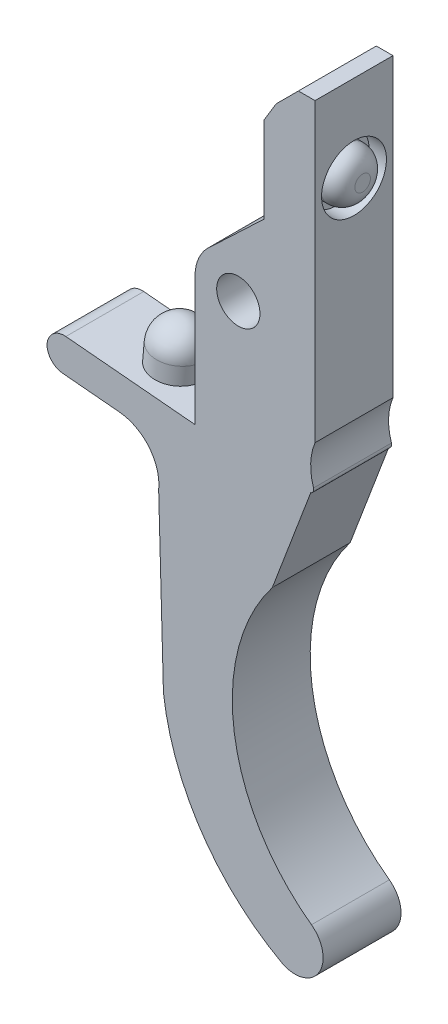
ISO-10303-21;
HEADER;
FILE_DESCRIPTION(('STEP AP214'),'2;1');
FILE_NAME('part.step','',(''),(''),'','','');
FILE_SCHEMA(('AUTOMOTIVE_DESIGN { 1 0 10303 214 1 1 1 1 }'));
ENDSEC;
DATA;
#1=APPLICATION_CONTEXT('core data for automotive mechanical design processes');
#2=APPLICATION_PROTOCOL_DEFINITION('international standard','automotive_design',2000,#1);
#3=PRODUCT_CONTEXT('',#1,'mechanical');
#4=PRODUCT('Part','Part','',(#3));
#5=PRODUCT_RELATED_PRODUCT_CATEGORY('part','',(#4));
#6=PRODUCT_DEFINITION_FORMATION('','',#4);
#7=PRODUCT_DEFINITION_CONTEXT('part definition',#1,'design');
#8=PRODUCT_DEFINITION('design','',#6,#7);
#9=PRODUCT_DEFINITION_SHAPE('','',#8);
#10=(LENGTH_UNIT() NAMED_UNIT(*) SI_UNIT(.MILLI.,.METRE.));
#11=(NAMED_UNIT(*) PLANE_ANGLE_UNIT() SI_UNIT($,.RADIAN.));
#12=(NAMED_UNIT(*) SI_UNIT($,.STERADIAN.) SOLID_ANGLE_UNIT());
#13=UNCERTAINTY_MEASURE_WITH_UNIT(LENGTH_MEASURE(1.E-05),#10,'distance_accuracy_value','');
#14=(GEOMETRIC_REPRESENTATION_CONTEXT(3) GLOBAL_UNCERTAINTY_ASSIGNED_CONTEXT((#13)) GLOBAL_UNIT_ASSIGNED_CONTEXT((#10,
#11,#12)) REPRESENTATION_CONTEXT('',''));
#15=CARTESIAN_POINT('',(0.,0.,0.));
#16=DIRECTION('',(0.,0.,1.));
#17=DIRECTION('',(1.,0.,0.));
#18=AXIS2_PLACEMENT_3D('',#15,#16,#17);
#19=CARTESIAN_POINT('',(8.86641034320198,0.,9.));
#20=DIRECTION('',(1.,0.,0.));
#21=DIRECTION('',(0.,1.,0.));
#22=AXIS2_PLACEMENT_3D('',#19,#20,#21);
#23=PLANE('',#22);
#24=CARTESIAN_POINT('',(8.86641034320198,14.5013390739284,4.5));
#25=DIRECTION('',(1.,0.,0.));
#26=DIRECTION('',(0.,1.,0.));
#27=AXIS2_PLACEMENT_3D('',#24,#25,#26);
#28=CIRCLE('',#27,3.75);
#29=CARTESIAN_POINT('',(8.86641034320198,18.2513390739284,4.5));
#30=VERTEX_POINT('',#29);
#31=EDGE_CURVE('E408',#30,#30,#28,.T.);
#32=ORIENTED_EDGE('',*,*,#31,.F.);
#33=EDGE_LOOP('',(#32));
#34=FACE_BOUND('',#33,.T.);
#35=DIRECTION('',(0.,-1.,0.));
#36=VECTOR('',#35,1.);
#37=CARTESIAN_POINT('',(8.86641034320198,0.,0.));
#38=LINE('',#37,#36);
#39=CARTESIAN_POINT('',(8.86641034320198,24.5013390739284,0.));
#40=VERTEX_POINT('',#39);
#41=CARTESIAN_POINT('',(8.86641034320198,-9.7282368546235,0.));
#42=VERTEX_POINT('',#41);
#43=EDGE_CURVE('E206',#40,#42,#38,.T.);
#44=ORIENTED_EDGE('',*,*,#43,.F.);
#45=DIRECTION('',(0.,0.,-1.));
#46=VECTOR('',#45,1.);
#47=CARTESIAN_POINT('',(8.86641034320198,24.5013390739284,9.));
#48=LINE('',#47,#46);
#49=CARTESIAN_POINT('',(8.86641034320198,24.5013390739284,9.));
#50=VERTEX_POINT('',#49);
#51=EDGE_CURVE('E123',#50,#40,#48,.T.);
#52=ORIENTED_EDGE('',*,*,#51,.F.);
#53=DIRECTION('',(0.,-1.,0.));
#54=VECTOR('',#53,1.);
#55=CARTESIAN_POINT('',(8.86641034320198,0.,9.));
#56=LINE('',#55,#54);
#57=CARTESIAN_POINT('',(8.86641034320198,-9.7282368546235,9.));
#58=VERTEX_POINT('',#57);
#59=EDGE_CURVE('E253',#50,#58,#56,.T.);
#60=ORIENTED_EDGE('',*,*,#59,.T.);
#61=DIRECTION('',(0.,0.,-1.));
#62=VECTOR('',#61,1.);
#63=CARTESIAN_POINT('',(8.86641034320198,-9.7282368546235,9.));
#64=LINE('',#63,#62);
#65=EDGE_CURVE('E52',#58,#42,#64,.T.);
#66=ORIENTED_EDGE('',*,*,#65,.T.);
#67=EDGE_LOOP('',(#44,#52,#60,#66));
#68=FACE_BOUND('',#67,.T.);
#69=ADVANCED_FACE('F35',(#34,#68),#23,.T.);
#70=CARTESIAN_POINT('',(0.,24.5013390739284,9.));
#71=DIRECTION('',(0.,1.,0.));
#72=DIRECTION('',(0.,0.,1.));
#73=AXIS2_PLACEMENT_3D('',#70,#71,#72);
#74=PLANE('',#73);
#75=DIRECTION('',(1.,0.,0.));
#76=VECTOR('',#75,1.);
#77=CARTESIAN_POINT('',(0.,24.5013390739284,0.));
#78=LINE('',#77,#76);
#79=CARTESIAN_POINT('',(6.94213708303368,24.5013390739284,0.));
#80=VERTEX_POINT('',#79);
#81=EDGE_CURVE('E208',#80,#40,#78,.T.);
#82=ORIENTED_EDGE('',*,*,#81,.F.);
#83=DIRECTION('',(0.,0.,-1.));
#84=VECTOR('',#83,1.);
#85=CARTESIAN_POINT('',(6.94213708303368,24.5013390739284,9.));
#86=LINE('',#85,#84);
#87=CARTESIAN_POINT('',(6.94213708303368,24.5013390739284,9.));
#88=VERTEX_POINT('',#87);
#89=EDGE_CURVE('E298',#88,#80,#86,.T.);
#90=ORIENTED_EDGE('',*,*,#89,.F.);
#91=DIRECTION('',(1.,0.,0.));
#92=VECTOR('',#91,1.);
#93=CARTESIAN_POINT('',(0.,24.5013390739284,9.));
#94=LINE('',#93,#92);
#95=EDGE_CURVE('E416',#88,#50,#94,.T.);
#96=ORIENTED_EDGE('',*,*,#95,.T.);
#97=ORIENTED_EDGE('',*,*,#51,.T.);
#98=EDGE_LOOP('',(#82,#90,#96,#97));
#99=FACE_BOUND('',#98,.T.);
#100=ADVANCED_FACE('F372',(#99),#74,.T.);
#101=CARTESIAN_POINT('',(-8.7796009954474,8.77960099544748,9.));
#102=DIRECTION('',(0.707106781186544,-0.707106781186551,0.));
#103=DIRECTION('',(0.707106781186551,0.707106781186544,0.));
#104=AXIS2_PLACEMENT_3D('',#101,#102,#103);
#105=PLANE('',#104);
#106=DIRECTION('',(-0.707106781186551,-0.707106781186544,0.));
#107=VECTOR('',#106,1.);
#108=CARTESIAN_POINT('',(-8.7796009954474,8.77960099544748,0.));
#109=LINE('',#108,#107);
#110=CARTESIAN_POINT('',(4.38418703911308,21.9433890300078,0.));
#111=VERTEX_POINT('',#110);
#112=EDGE_CURVE('E212',#80,#111,#109,.T.);
#113=ORIENTED_EDGE('',*,*,#112,.T.);
#114=DIRECTION('',(0.,0.,-1.));
#115=VECTOR('',#114,1.);
#116=CARTESIAN_POINT('',(4.38418703911308,21.9433890300078,9.));
#117=LINE('',#116,#115);
#118=CARTESIAN_POINT('',(4.38418703911308,21.9433890300078,9.));
#119=VERTEX_POINT('',#118);
#120=EDGE_CURVE('E295',#119,#111,#117,.T.);
#121=ORIENTED_EDGE('',*,*,#120,.F.);
#122=DIRECTION('',(-0.707106781186551,-0.707106781186544,0.));
#123=VECTOR('',#122,1.);
#124=CARTESIAN_POINT('',(-8.7796009954474,8.77960099544748,9.));
#125=LINE('',#124,#123);
#126=EDGE_CURVE('E419',#88,#119,#125,.T.);
#127=ORIENTED_EDGE('',*,*,#126,.F.);
#128=ORIENTED_EDGE('',*,*,#89,.T.);
#129=EDGE_LOOP('',(#113,#121,#127,#128));
#130=FACE_BOUND('',#129,.T.);
#131=ADVANCED_FACE('F378',(#130),#105,.F.);
#132=CARTESIAN_POINT('',(-6.54897874261379,3.98764051774951,9.));
#133=DIRECTION('',(0.854122918146898,-0.520071188104309,0.));
#134=DIRECTION('',(0.520071188104309,0.854122918146898,0.));
#135=AXIS2_PLACEMENT_3D('',#132,#133,#134);
#136=PLANE('',#135);
#137=DIRECTION('',(-0.520071188104309,-0.854122918146898,0.));
#138=VECTOR('',#137,1.);
#139=CARTESIAN_POINT('',(-6.54897874261379,3.98764051774951,0.));
#140=LINE('',#139,#138);
#141=CARTESIAN_POINT('',(2.98776814859473,19.6500234196719,0.));
#142=VERTEX_POINT('',#141);
#143=EDGE_CURVE('E214',#111,#142,#140,.T.);
#144=ORIENTED_EDGE('',*,*,#143,.T.);
#145=DIRECTION('',(0.,0.,-1.));
#146=VECTOR('',#145,1.);
#147=CARTESIAN_POINT('',(2.98776814859473,19.6500234196719,9.));
#148=LINE('',#147,#146);
#149=CARTESIAN_POINT('',(2.98776814859473,19.6500234196719,9.));
#150=VERTEX_POINT('',#149);
#151=EDGE_CURVE('E292',#150,#142,#148,.T.);
#152=ORIENTED_EDGE('',*,*,#151,.F.);
#153=DIRECTION('',(-0.520071188104309,-0.854122918146898,0.));
#154=VECTOR('',#153,1.);
#155=CARTESIAN_POINT('',(-6.54897874261379,3.98764051774951,9.));
#156=LINE('',#155,#154);
#157=EDGE_CURVE('E421',#119,#150,#156,.T.);
#158=ORIENTED_EDGE('',*,*,#157,.F.);
#159=ORIENTED_EDGE('',*,*,#120,.T.);
#160=EDGE_LOOP('',(#144,#152,#158,#159));
#161=FACE_BOUND('',#160,.T.);
#162=ADVANCED_FACE('F454',(#161),#136,.F.);
#163=CARTESIAN_POINT('',(2.98776814859473,0.,9.));
#164=DIRECTION('',(1.,0.,0.));
#165=DIRECTION('',(0.,0.,-1.));
#166=AXIS2_PLACEMENT_3D('',#163,#164,#165);
#167=PLANE('',#166);
#168=DIRECTION('',(0.,-1.,0.));
#169=VECTOR('',#168,1.);
#170=CARTESIAN_POINT('',(2.98776814859473,0.,0.));
#171=LINE('',#170,#169);
#172=CARTESIAN_POINT('',(2.98776814859473,9.70876495048378,0.));
#173=VERTEX_POINT('',#172);
#174=EDGE_CURVE('E216',#142,#173,#171,.T.);
#175=ORIENTED_EDGE('',*,*,#174,.T.);
#176=DIRECTION('',(0.,0.,-1.));
#177=VECTOR('',#176,1.);
#178=CARTESIAN_POINT('',(2.98776814859473,9.70876495048378,9.));
#179=LINE('',#178,#177);
#180=CARTESIAN_POINT('',(2.98776814859473,9.70876495048378,9.));
#181=VERTEX_POINT('',#180);
#182=EDGE_CURVE('E289',#181,#173,#179,.T.);
#183=ORIENTED_EDGE('',*,*,#182,.F.);
#184=DIRECTION('',(0.,-1.,0.));
#185=VECTOR('',#184,1.);
#186=CARTESIAN_POINT('',(2.98776814859473,0.,9.));
#187=LINE('',#186,#185);
#188=EDGE_CURVE('E423',#150,#181,#187,.T.);
#189=ORIENTED_EDGE('',*,*,#188,.F.);
#190=ORIENTED_EDGE('',*,*,#151,.T.);
#191=EDGE_LOOP('',(#175,#183,#189,#190));
#192=FACE_BOUND('',#191,.T.);
#193=ADVANCED_FACE('F448',(#192),#167,.F.);
#194=CARTESIAN_POINT('',(-3.43271517060493,3.61933643419605,9.));
#195=DIRECTION('',(0.688153412758932,-0.725565214510891,0.));
#196=DIRECTION('',(0.725565214510891,0.688153412758932,0.));
#197=AXIS2_PLACEMENT_3D('',#194,#195,#196);
#198=PLANE('',#197);
#199=DIRECTION('',(-0.725565214510891,-0.688153412758932,0.));
#200=VECTOR('',#199,1.);
#201=CARTESIAN_POINT('',(-3.43271517060493,3.61933643419605,0.));
#202=LINE('',#201,#200);
#203=CARTESIAN_POINT('',(-3.18467124544874,3.85459064732067,0.));
#204=VERTEX_POINT('',#203);
#205=EDGE_CURVE('E218',#173,#204,#202,.T.);
#206=ORIENTED_EDGE('',*,*,#205,.T.);
#207=DIRECTION('',(0.,0.,-1.));
#208=VECTOR('',#207,1.);
#209=CARTESIAN_POINT('',(-3.18467124544874,3.85459064732067,9.));
#210=LINE('',#209,#208);
#211=CARTESIAN_POINT('',(-3.18467124544874,3.85459064732067,9.));
#212=VERTEX_POINT('',#211);
#213=EDGE_CURVE('E286',#212,#204,#210,.T.);
#214=ORIENTED_EDGE('',*,*,#213,.F.);
#215=DIRECTION('',(-0.725565214510891,-0.688153412758932,0.));
#216=VECTOR('',#215,1.);
#217=CARTESIAN_POINT('',(-3.43271517060493,3.61933643419605,9.));
#218=LINE('',#217,#216);
#219=EDGE_CURVE('E425',#181,#212,#218,.T.);
#220=ORIENTED_EDGE('',*,*,#219,.F.);
#221=ORIENTED_EDGE('',*,*,#182,.T.);
#222=EDGE_LOOP('',(#206,#214,#220,#221));
#223=FACE_BOUND('',#222,.T.);
#224=ADVANCED_FACE('F444',(#223),#198,.F.);
#225=CARTESIAN_POINT('',(0.,0.,9.));
#226=DIRECTION('',(0.,0.,-1.));
#227=DIRECTION('',(-1.,0.,0.));
#228=AXIS2_PLACEMENT_3D('',#225,#226,#227);
#229=CYLINDRICAL_SURFACE('',#228,5.);
#230=CARTESIAN_POINT('',(0.,0.,0.));
#231=DIRECTION('',(0.,0.,1.));
#232=DIRECTION('',(1.,0.,0.));
#233=AXIS2_PLACEMENT_3D('',#230,#231,#232);
#234=CIRCLE('',#233,5.);
#235=CARTESIAN_POINT('',(-5.,0.,0.));
#236=VERTEX_POINT('',#235);
#237=EDGE_CURVE('E220',#204,#236,#234,.T.);
#238=ORIENTED_EDGE('',*,*,#237,.T.);
#239=DIRECTION('',(0.,0.,-1.));
#240=VECTOR('',#239,1.);
#241=CARTESIAN_POINT('',(-5.,0.,9.));
#242=LINE('',#241,#240);
#243=CARTESIAN_POINT('',(-5.,0.,9.));
#244=VERTEX_POINT('',#243);
#245=EDGE_CURVE('E283',#244,#236,#242,.T.);
#246=ORIENTED_EDGE('',*,*,#245,.F.);
#247=CARTESIAN_POINT('',(0.,0.,9.));
#248=DIRECTION('',(0.,0.,1.));
#249=DIRECTION('',(1.,0.,0.));
#250=AXIS2_PLACEMENT_3D('',#247,#248,#249);
#251=CIRCLE('',#250,5.);
#252=EDGE_CURVE('E427',#212,#244,#251,.T.);
#253=ORIENTED_EDGE('',*,*,#252,.F.);
#254=ORIENTED_EDGE('',*,*,#213,.T.);
#255=EDGE_LOOP('',(#238,#246,#253,#254));
#256=FACE_BOUND('',#255,.T.);
#257=ADVANCED_FACE('F440',(#256),#229,.T.);
#258=CARTESIAN_POINT('',(-5.,0.,9.));
#259=DIRECTION('',(1.,0.,0.));
#260=DIRECTION('',(0.,0.,-1.));
#261=AXIS2_PLACEMENT_3D('',#258,#259,#260);
#262=PLANE('',#261);
#263=DIRECTION('',(0.,-1.,0.));
#264=VECTOR('',#263,1.);
#265=CARTESIAN_POINT('',(-5.,0.,0.));
#266=LINE('',#265,#264);
#267=CARTESIAN_POINT('',(-5.,-14.8544261697836,0.));
#268=VERTEX_POINT('',#267);
#269=EDGE_CURVE('E222',#236,#268,#266,.T.);
#270=ORIENTED_EDGE('',*,*,#269,.T.);
#271=DIRECTION('',(0.,0.,-1.));
#272=VECTOR('',#271,1.);
#273=CARTESIAN_POINT('',(-5.,-14.8544261697836,9.));
#274=LINE('',#273,#272);
#275=CARTESIAN_POINT('',(-5.,-14.8544261697836,9.));
#276=VERTEX_POINT('',#275);
#277=EDGE_CURVE('E280',#276,#268,#274,.T.);
#278=ORIENTED_EDGE('',*,*,#277,.F.);
#279=DIRECTION('',(0.,-1.,0.));
#280=VECTOR('',#279,1.);
#281=CARTESIAN_POINT('',(-5.,0.,9.));
#282=LINE('',#281,#280);
#283=EDGE_CURVE('E429',#244,#276,#282,.T.);
#284=ORIENTED_EDGE('',*,*,#283,.F.);
#285=ORIENTED_EDGE('',*,*,#245,.T.);
#286=EDGE_LOOP('',(#270,#278,#284,#285));
#287=FACE_BOUND('',#286,.T.);
#288=ADVANCED_FACE('F315',(#287),#262,.F.);
#289=CARTESIAN_POINT('',(-1.38130681904962,-15.1836310581113,9.));
#290=DIRECTION('',(-0.0905992835595562,-0.995887428286197,0.));
#291=DIRECTION('',(0.995887428286197,-0.0905992835595562,0.));
#292=AXIS2_PLACEMENT_3D('',#289,#290,#291);
#293=PLANE('',#292);
#294=CARTESIAN_POINT('',(-11.4732682838603,-14.2655308266464,4.5));
#295=DIRECTION('',(-0.0905992835595562,-0.995887428286197,0.));
#296=DIRECTION('',(0.995887428286197,-0.0905992835595562,0.));
#297=AXIS2_PLACEMENT_3D('',#294,#295,#296);
#298=CIRCLE('',#297,2.9);
#299=CARTESIAN_POINT('',(-8.58519474183031,-14.5282687489692,4.5));
#300=VERTEX_POINT('',#299);
#301=EDGE_CURVE('E44',#300,#300,#298,.F.);
#302=ORIENTED_EDGE('',*,*,#301,.F.);
#303=EDGE_LOOP('',(#302));
#304=FACE_BOUND('',#303,.T.);
#305=DIRECTION('',(-0.995887428286197,0.0905992835595562,0.));
#306=VECTOR('',#305,1.);
#307=CARTESIAN_POINT('',(-1.38130681904962,-15.1836310581113,0.));
#308=LINE('',#307,#306);
#309=CARTESIAN_POINT('',(-19.9214872547559,-13.4969674686025,0.));
#310=VERTEX_POINT('',#309);
#311=EDGE_CURVE('E224',#268,#310,#308,.T.);
#312=ORIENTED_EDGE('',*,*,#311,.T.);
#313=DIRECTION('',(0.,0.,-1.));
#314=VECTOR('',#313,1.);
#315=CARTESIAN_POINT('',(-19.9214872547559,-13.4969674686025,9.));
#316=LINE('',#315,#314);
#317=CARTESIAN_POINT('',(-19.9214872547559,-13.4969674686025,9.));
#318=VERTEX_POINT('',#317);
#319=EDGE_CURVE('E277',#318,#310,#316,.T.);
#320=ORIENTED_EDGE('',*,*,#319,.F.);
#321=DIRECTION('',(-0.995887428286197,0.0905992835595562,0.));
#322=VECTOR('',#321,1.);
#323=CARTESIAN_POINT('',(-1.38130681904962,-15.1836310581113,9.));
#324=LINE('',#323,#322);
#325=EDGE_CURVE('E431',#276,#318,#324,.T.);
#326=ORIENTED_EDGE('',*,*,#325,.F.);
#327=ORIENTED_EDGE('',*,*,#277,.T.);
#328=EDGE_LOOP('',(#312,#320,#326,#327));
#329=FACE_BOUND('',#328,.T.);
#330=ADVANCED_FACE('F311',(#304,#329),#293,.F.);
#331=CARTESIAN_POINT('',(-20.102685821875,-15.4887423251749,9.));
#332=DIRECTION('',(0.,0.,-1.));
#333=DIRECTION('',(-1.,0.,0.));
#334=AXIS2_PLACEMENT_3D('',#331,#332,#333);
#335=CYLINDRICAL_SURFACE('',#334,2.);
#336=CARTESIAN_POINT('',(-20.102685821875,-15.4887423251749,0.));
#337=DIRECTION('',(0.,0.,1.));
#338=DIRECTION('',(1.,0.,0.));
#339=AXIS2_PLACEMENT_3D('',#336,#337,#338);
#340=CIRCLE('',#339,2.);
#341=CARTESIAN_POINT('',(-22.1026733060009,-15.4958178703594,0.));
#342=VERTEX_POINT('',#341);
#343=EDGE_CURVE('E226',#310,#342,#340,.T.);
#344=ORIENTED_EDGE('',*,*,#343,.T.);
#345=DIRECTION('',(0.,0.,-1.));
#346=VECTOR('',#345,1.);
#347=CARTESIAN_POINT('',(-22.1026733060009,-15.4958178703594,9.));
#348=LINE('',#347,#346);
#349=CARTESIAN_POINT('',(-22.1026733060009,-15.4958178703594,9.));
#350=VERTEX_POINT('',#349);
#351=EDGE_CURVE('E274',#350,#342,#348,.T.);
#352=ORIENTED_EDGE('',*,*,#351,.F.);
#353=CARTESIAN_POINT('',(-20.102685821875,-15.4887423251749,9.));
#354=DIRECTION('',(0.,0.,1.));
#355=DIRECTION('',(1.,0.,0.));
#356=AXIS2_PLACEMENT_3D('',#353,#354,#355);
#357=CIRCLE('',#356,2.);
#358=EDGE_CURVE('E327',#318,#350,#357,.T.);
#359=ORIENTED_EDGE('',*,*,#358,.F.);
#360=ORIENTED_EDGE('',*,*,#319,.T.);
#361=EDGE_LOOP('',(#344,#352,#359,#360));
#362=FACE_BOUND('',#361,.T.);
#363=ADVANCED_FACE('F314',(#362),#335,.T.);
#364=CARTESIAN_POINT('',(-20.1065365163499,-15.371568455867,9.));
#365=DIRECTION('',(0.,0.,-1.));
#366=DIRECTION('',(-1.,0.,0.));
#367=AXIS2_PLACEMENT_3D('',#364,#365,#366);
#368=CYLINDRICAL_SURFACE('',#367,2.);
#369=CARTESIAN_POINT('',(-20.1065365163499,-15.371568455867,0.));
#370=DIRECTION('',(0.,0.,1.));
#371=DIRECTION('',(1.,0.,0.));
#372=AXIS2_PLACEMENT_3D('',#369,#370,#371);
#373=CIRCLE('',#372,2.);
#374=CARTESIAN_POINT('',(-20.287735083469,-17.3633433124394,0.));
#375=VERTEX_POINT('',#374);
#376=EDGE_CURVE('E228',#342,#375,#373,.T.);
#377=ORIENTED_EDGE('',*,*,#376,.T.);
#378=DIRECTION('',(0.,0.,-1.));
#379=VECTOR('',#378,1.);
#380=CARTESIAN_POINT('',(-20.287735083469,-17.3633433124394,9.));
#381=LINE('',#380,#379);
#382=CARTESIAN_POINT('',(-20.287735083469,-17.3633433124394,9.));
#383=VERTEX_POINT('',#382);
#384=EDGE_CURVE('E271',#383,#375,#381,.T.);
#385=ORIENTED_EDGE('',*,*,#384,.F.);
#386=CARTESIAN_POINT('',(-20.1065365163499,-15.371568455867,9.));
#387=DIRECTION('',(0.,0.,1.));
#388=DIRECTION('',(1.,0.,0.));
#389=AXIS2_PLACEMENT_3D('',#386,#387,#388);
#390=CIRCLE('',#389,2.);
#391=EDGE_CURVE('E344',#350,#383,#390,.T.);
#392=ORIENTED_EDGE('',*,*,#391,.F.);
#393=ORIENTED_EDGE('',*,*,#351,.T.);
#394=EDGE_LOOP('',(#377,#385,#392,#393));
#395=FACE_BOUND('',#394,.T.);
#396=ADVANCED_FACE('F335',(#395),#368,.T.);
#397=CARTESIAN_POINT('',(-1.73316335058424,-19.0513161274458,9.));
#398=DIRECTION('',(0.090599283559557,0.995887428286197,0.));
#399=DIRECTION('',(-0.995887428286197,0.090599283559557,0.));
#400=AXIS2_PLACEMENT_3D('',#397,#398,#399);
#401=PLANE('',#400);
#402=DIRECTION('',(0.995887428286197,-0.090599283559557,0.));
#403=VECTOR('',#402,1.);
#404=CARTESIAN_POINT('',(-1.73316335058424,-19.0513161274458,0.));
#405=LINE('',#404,#403);
#406=CARTESIAN_POINT('',(-13.71695870258,-17.9611093004718,0.));
#407=VERTEX_POINT('',#406);
#408=EDGE_CURVE('E230',#375,#407,#405,.T.);
#409=ORIENTED_EDGE('',*,*,#408,.T.);
#410=DIRECTION('',(0.,0.,-1.));
#411=VECTOR('',#410,1.);
#412=CARTESIAN_POINT('',(-13.71695870258,-17.9611093004718,9.));
#413=LINE('',#412,#411);
#414=CARTESIAN_POINT('',(-13.71695870258,-17.9611093004718,9.));
#415=VERTEX_POINT('',#414);
#416=EDGE_CURVE('E268',#415,#407,#413,.T.);
#417=ORIENTED_EDGE('',*,*,#416,.F.);
#418=DIRECTION('',(0.995887428286197,-0.090599283559557,0.));
#419=VECTOR('',#418,1.);
#420=CARTESIAN_POINT('',(-1.73316335058424,-19.0513161274458,9.));
#421=LINE('',#420,#419);
#422=EDGE_CURVE('E341',#383,#415,#421,.T.);
#423=ORIENTED_EDGE('',*,*,#422,.F.);
#424=ORIENTED_EDGE('',*,*,#384,.T.);
#425=EDGE_LOOP('',(#409,#417,#423,#424));
#426=FACE_BOUND('',#425,.T.);
#427=ADVANCED_FACE('F339',(#426),#401,.F.);
#428=CARTESIAN_POINT('',(-14.1699551203777,-22.9405464419028,9.));
#429=DIRECTION('',(0.,0.,-1.));
#430=DIRECTION('',(-1.,0.,0.));
#431=AXIS2_PLACEMENT_3D('',#428,#429,#430);
#432=CYLINDRICAL_SURFACE('',#431,5.);
#433=CARTESIAN_POINT('',(-14.1699551203777,-22.9405464419028,0.));
#434=DIRECTION('',(0.,0.,1.));
#435=DIRECTION('',(1.,0.,0.));
#436=AXIS2_PLACEMENT_3D('',#433,#434,#435);
#437=CIRCLE('',#436,5.);
#438=CARTESIAN_POINT('',(-9.20101774553042,-23.497018691746,0.));
#439=VERTEX_POINT('',#438);
#440=EDGE_CURVE('E232',#407,#439,#437,.F.);
#441=ORIENTED_EDGE('',*,*,#440,.T.);
#442=DIRECTION('',(0.,0.,-1.));
#443=VECTOR('',#442,1.);
#444=CARTESIAN_POINT('',(-9.20101774553042,-23.497018691746,9.));
#445=LINE('',#444,#443);
#446=CARTESIAN_POINT('',(-9.20101774553042,-23.497018691746,9.));
#447=VERTEX_POINT('',#446);
#448=EDGE_CURVE('E265',#447,#439,#445,.T.);
#449=ORIENTED_EDGE('',*,*,#448,.F.);
#450=CARTESIAN_POINT('',(-14.1699551203777,-22.9405464419028,9.));
#451=DIRECTION('',(0.,0.,1.));
#452=DIRECTION('',(1.,0.,0.));
#453=AXIS2_PLACEMENT_3D('',#450,#451,#452);
#454=CIRCLE('',#453,5.);
#455=EDGE_CURVE('E343',#415,#447,#454,.F.);
#456=ORIENTED_EDGE('',*,*,#455,.F.);
#457=ORIENTED_EDGE('',*,*,#416,.T.);
#458=EDGE_LOOP('',(#441,#449,#456,#457));
#459=FACE_BOUND('',#458,.T.);
#460=ADVANCED_FACE('F480',(#459),#432,.F.);
#461=CARTESIAN_POINT('',(-9.84212065088508,-0.271677914422432,9.));
#462=DIRECTION('',(0.999619238345447,0.0275930848161071,0.));
#463=DIRECTION('',(-0.0275930848161071,0.999619238345447,0.));
#464=AXIS2_PLACEMENT_3D('',#461,#462,#463);
#465=PLANE('',#464);
#466=DIRECTION('',(0.0275930848161071,-0.999619238345447,0.));
#467=VECTOR('',#466,1.);
#468=CARTESIAN_POINT('',(-9.84212065088508,-0.271677914422432,0.));
#469=LINE('',#468,#467);
#470=CARTESIAN_POINT('',(-8.64872629860436,-43.5049721047207,0.));
#471=VERTEX_POINT('',#470);
#472=EDGE_CURVE('E234',#439,#471,#469,.T.);
#473=ORIENTED_EDGE('',*,*,#472,.T.);
#474=DIRECTION('',(0.,0.,-1.));
#475=VECTOR('',#474,1.);
#476=CARTESIAN_POINT('',(-8.64872629860436,-43.5049721047207,9.));
#477=LINE('',#476,#475);
#478=CARTESIAN_POINT('',(-8.64872629860436,-43.5049721047207,9.));
#479=VERTEX_POINT('',#478);
#480=EDGE_CURVE('E262',#479,#471,#477,.T.);
#481=ORIENTED_EDGE('',*,*,#480,.F.);
#482=DIRECTION('',(0.0275930848161071,-0.999619238345447,0.));
#483=VECTOR('',#482,1.);
#484=CARTESIAN_POINT('',(-9.84212065088508,-0.271677914422432,9.));
#485=LINE('',#484,#483);
#486=EDGE_CURVE('E346',#447,#479,#485,.T.);
#487=ORIENTED_EDGE('',*,*,#486,.F.);
#488=ORIENTED_EDGE('',*,*,#448,.T.);
#489=EDGE_LOOP('',(#473,#481,#487,#488));
#490=FACE_BOUND('',#489,.T.);
#491=ADVANCED_FACE('F483',(#490),#465,.F.);
#492=CARTESIAN_POINT('',(17.9123533856709,-40.2330398349688,9.));
#493=DIRECTION('',(0.,0.,-1.));
#494=DIRECTION('',(-1.,0.,0.));
#495=AXIS2_PLACEMENT_3D('',#492,#493,#494);
#496=CYLINDRICAL_SURFACE('',#495,26.7618477458539);
#497=CARTESIAN_POINT('',(17.9123533856709,-40.2330398349688,0.));
#498=DIRECTION('',(0.,0.,1.));
#499=DIRECTION('',(1.,0.,0.));
#500=AXIS2_PLACEMENT_3D('',#497,#498,#499);
#501=CIRCLE('',#500,26.7618477458539);
#502=CARTESIAN_POINT('',(5.17863173248401,-63.7712816476323,0.));
#503=VERTEX_POINT('',#502);
#504=EDGE_CURVE('E236',#471,#503,#501,.T.);
#505=ORIENTED_EDGE('',*,*,#504,.T.);
#506=DIRECTION('',(0.,0.,-1.));
#507=VECTOR('',#506,1.);
#508=CARTESIAN_POINT('',(5.17863173248401,-63.7712816476323,9.));
#509=LINE('',#508,#507);
#510=CARTESIAN_POINT('',(5.17863173248401,-63.7712816476323,9.));
#511=VERTEX_POINT('',#510);
#512=EDGE_CURVE('E259',#511,#503,#509,.T.);
#513=ORIENTED_EDGE('',*,*,#512,.F.);
#514=CARTESIAN_POINT('',(17.9123533856709,-40.2330398349688,9.));
#515=DIRECTION('',(0.,0.,1.));
#516=DIRECTION('',(1.,0.,0.));
#517=AXIS2_PLACEMENT_3D('',#514,#515,#516);
#518=CIRCLE('',#517,26.7618477458539);
#519=EDGE_CURVE('E352',#479,#511,#518,.T.);
#520=ORIENTED_EDGE('',*,*,#519,.F.);
#521=ORIENTED_EDGE('',*,*,#480,.T.);
#522=EDGE_LOOP('',(#505,#513,#520,#521));
#523=FACE_BOUND('',#522,.T.);
#524=ADVANCED_FACE('F487',(#523),#496,.T.);
#525=CARTESIAN_POINT('',(6.53898546582475,-60.8080600715775,9.));
#526=DIRECTION('',(0.,0.,-1.));
#527=DIRECTION('',(-1.,0.,0.));
#528=AXIS2_PLACEMENT_3D('',#525,#526,#527);
#529=CYLINDRICAL_SURFACE('',#528,3.26055890739781);
#530=CARTESIAN_POINT('',(6.53898546582475,-60.8080600715775,0.));
#531=DIRECTION('',(0.,0.,1.));
#532=DIRECTION('',(1.,0.,0.));
#533=AXIS2_PLACEMENT_3D('',#530,#531,#532);
#534=CIRCLE('',#533,3.26055890739781);
#535=CARTESIAN_POINT('',(8.45300526200647,-58.1684061911538,0.));
#536=VERTEX_POINT('',#535);
#537=EDGE_CURVE('E238',#503,#536,#534,.T.);
#538=ORIENTED_EDGE('',*,*,#537,.T.);
#539=DIRECTION('',(0.,0.,-1.));
#540=VECTOR('',#539,1.);
#541=CARTESIAN_POINT('',(8.45300526200647,-58.1684061911538,9.));
#542=LINE('',#541,#540);
#543=CARTESIAN_POINT('',(8.45300526200647,-58.1684061911538,9.));
#544=VERTEX_POINT('',#543);
#545=EDGE_CURVE('E257',#544,#536,#542,.T.);
#546=ORIENTED_EDGE('',*,*,#545,.F.);
#547=CARTESIAN_POINT('',(6.53898546582475,-60.8080600715775,9.));
#548=DIRECTION('',(0.,0.,1.));
#549=DIRECTION('',(1.,0.,0.));
#550=AXIS2_PLACEMENT_3D('',#547,#548,#549);
#551=CIRCLE('',#550,3.26055890739781);
#552=EDGE_CURVE('E354',#511,#544,#551,.T.);
#553=ORIENTED_EDGE('',*,*,#552,.F.);
#554=ORIENTED_EDGE('',*,*,#512,.T.);
#555=EDGE_LOOP('',(#538,#546,#553,#554));
#556=FACE_BOUND('',#555,.T.);
#557=ADVANCED_FACE('F491',(#556),#529,.T.);
#558=CARTESIAN_POINT('',(21.4541991257551,-40.2382615285716,9.));
#559=DIRECTION('',(0.,0.,-1.));
#560=DIRECTION('',(-1.,0.,0.));
#561=AXIS2_PLACEMENT_3D('',#558,#559,#560);
#562=CYLINDRICAL_SURFACE('',#561,22.1477116087396);
#563=CARTESIAN_POINT('',(21.4541991257551,-40.2382615285716,0.));
#564=DIRECTION('',(0.,0.,1.));
#565=DIRECTION('',(1.,0.,0.));
#566=AXIS2_PLACEMENT_3D('',#563,#564,#565);
#567=CIRCLE('',#566,22.1477116087396);
#568=CARTESIAN_POINT('',(3.92425171108357,-26.7023066992014,0.));
#569=VERTEX_POINT('',#568);
#570=EDGE_CURVE('E241',#569,#536,#567,.T.);
#571=ORIENTED_EDGE('',*,*,#570,.F.);
#572=DIRECTION('',(0.,0.,-1.));
#573=VECTOR('',#572,1.);
#574=CARTESIAN_POINT('',(3.92425171108357,-26.7023066992014,9.));
#575=LINE('',#574,#573);
#576=CARTESIAN_POINT('',(3.92425171108357,-26.7023066992014,9.));
#577=VERTEX_POINT('',#576);
#578=EDGE_CURVE('E185',#577,#569,#575,.T.);
#579=ORIENTED_EDGE('',*,*,#578,.F.);
#580=CARTESIAN_POINT('',(21.4541991257551,-40.2382615285716,9.));
#581=DIRECTION('',(0.,0.,1.));
#582=DIRECTION('',(1.,0.,0.));
#583=AXIS2_PLACEMENT_3D('',#580,#581,#582);
#584=CIRCLE('',#583,22.1477116087396);
#585=EDGE_CURVE('E195',#577,#544,#584,.T.);
#586=ORIENTED_EDGE('',*,*,#585,.T.);
#587=ORIENTED_EDGE('',*,*,#545,.T.);
#588=EDGE_LOOP('',(#571,#579,#586,#587));
#589=FACE_BOUND('',#588,.T.);
#590=ADVANCED_FACE('F357',(#589),#562,.F.);
#591=CARTESIAN_POINT('',(12.2835869666691,-4.65801386095649,9.));
#592=DIRECTION('',(0.935029774755719,-0.35456920385204,0.));
#593=DIRECTION('',(0.35456920385204,0.935029774755719,0.));
#594=AXIS2_PLACEMENT_3D('',#591,#592,#593);
#595=PLANE('',#594);
#596=DIRECTION('',(-0.35456920385204,-0.935029774755719,0.));
#597=VECTOR('',#596,1.);
#598=CARTESIAN_POINT('',(12.2835869666691,-4.65801386095649,0.));
#599=LINE('',#598,#597);
#600=CARTESIAN_POINT('',(8.37011859951693,-14.9781697179748,0.));
#601=VERTEX_POINT('',#600);
#602=EDGE_CURVE('E181',#601,#569,#599,.T.);
#603=ORIENTED_EDGE('',*,*,#602,.F.);
#604=DIRECTION('',(0.,0.,-1.));
#605=VECTOR('',#604,1.);
#606=CARTESIAN_POINT('',(8.37011859951693,-14.9781697179748,9.));
#607=LINE('',#606,#605);
#608=CARTESIAN_POINT('',(8.37011859951693,-14.9781697179748,9.));
#609=VERTEX_POINT('',#608);
#610=EDGE_CURVE('E176',#609,#601,#607,.T.);
#611=ORIENTED_EDGE('',*,*,#610,.F.);
#612=DIRECTION('',(-0.35456920385204,-0.935029774755719,0.));
#613=VECTOR('',#612,1.);
#614=CARTESIAN_POINT('',(12.2835869666691,-4.65801386095649,9.));
#615=LINE('',#614,#613);
#616=EDGE_CURVE('E179',#609,#577,#615,.T.);
#617=ORIENTED_EDGE('',*,*,#616,.T.);
#618=ORIENTED_EDGE('',*,*,#578,.T.);
#619=EDGE_LOOP('',(#603,#611,#617,#618));
#620=FACE_BOUND('',#619,.T.);
#621=ADVANCED_FACE('F178',(#620),#595,.T.);
#622=CARTESIAN_POINT('',(8.21678013349389,-14.5022628837754,9.));
#623=DIRECTION('',(0.,0.,-1.));
#624=DIRECTION('',(-1.,0.,0.));
#625=AXIS2_PLACEMENT_3D('',#622,#623,#624);
#626=CYLINDRICAL_SURFACE('',#625,0.5);
#627=CARTESIAN_POINT('',(8.21678013349389,-14.5022628837754,0.));
#628=DIRECTION('',(0.,0.,1.));
#629=DIRECTION('',(1.,0.,0.));
#630=AXIS2_PLACEMENT_3D('',#627,#628,#629);
#631=CIRCLE('',#630,0.5);
#632=CARTESIAN_POINT('',(8.69193724020471,-14.3466167339927,0.));
#633=VERTEX_POINT('',#632);
#634=EDGE_CURVE('E245',#633,#601,#631,.F.);
#635=ORIENTED_EDGE('',*,*,#634,.F.);
#636=DIRECTION('',(0.,0.,-1.));
#637=VECTOR('',#636,1.);
#638=CARTESIAN_POINT('',(8.69193724020471,-14.3466167339927,9.));
#639=LINE('',#638,#637);
#640=CARTESIAN_POINT('',(8.69193724020471,-14.3466167339927,9.));
#641=VERTEX_POINT('',#640);
#642=EDGE_CURVE('E114',#641,#633,#639,.T.);
#643=ORIENTED_EDGE('',*,*,#642,.F.);
#644=CARTESIAN_POINT('',(8.21678013349389,-14.5022628837754,9.));
#645=DIRECTION('',(0.,0.,1.));
#646=DIRECTION('',(1.,0.,0.));
#647=AXIS2_PLACEMENT_3D('',#644,#645,#646);
#648=CIRCLE('',#647,0.5);
#649=EDGE_CURVE('E193',#641,#609,#648,.F.);
#650=ORIENTED_EDGE('',*,*,#649,.T.);
#651=ORIENTED_EDGE('',*,*,#610,.T.);
#652=EDGE_LOOP('',(#635,#643,#650,#651));
#653=FACE_BOUND('',#652,.T.);
#654=ADVANCED_FACE('F197',(#653),#626,.T.);
#655=CARTESIAN_POINT('',(15.0215183563068,-12.2732500168692,9.));
#656=DIRECTION('',(0.,0.,-1.));
#657=DIRECTION('',(-1.,0.,0.));
#658=AXIS2_PLACEMENT_3D('',#655,#656,#657);
#659=CYLINDRICAL_SURFACE('',#658,6.66051399285304);
#660=CARTESIAN_POINT('',(15.0215183563068,-12.2732500168692,0.));
#661=DIRECTION('',(0.,0.,1.));
#662=DIRECTION('',(1.,0.,0.));
#663=AXIS2_PLACEMENT_3D('',#660,#661,#662);
#664=CIRCLE('',#663,6.66051399285304);
#665=EDGE_CURVE('E247',#42,#633,#664,.T.);
#666=ORIENTED_EDGE('',*,*,#665,.F.);
#667=ORIENTED_EDGE('',*,*,#65,.F.);
#668=CARTESIAN_POINT('',(15.0215183563068,-12.2732500168692,9.));
#669=DIRECTION('',(0.,0.,1.));
#670=DIRECTION('',(1.,0.,0.));
#671=AXIS2_PLACEMENT_3D('',#668,#669,#670);
#672=CIRCLE('',#671,6.66051399285304);
#673=EDGE_CURVE('E198',#58,#641,#672,.T.);
#674=ORIENTED_EDGE('',*,*,#673,.T.);
#675=ORIENTED_EDGE('',*,*,#642,.T.);
#676=EDGE_LOOP('',(#666,#667,#674,#675));
#677=FACE_BOUND('',#676,.T.);
#678=ADVANCED_FACE('F360',(#677),#659,.F.);
#679=CARTESIAN_POINT('',(0.,0.,9.));
#680=DIRECTION('',(0.,0.,-1.));
#681=DIRECTION('',(-1.,0.,0.));
#682=AXIS2_PLACEMENT_3D('',#679,#680,#681);
#683=CYLINDRICAL_SURFACE('',#682,2.5);
#684=CARTESIAN_POINT('',(0.,0.,9.));
#685=DIRECTION('',(0.,0.,1.));
#686=DIRECTION('',(1.,0.,0.));
#687=AXIS2_PLACEMENT_3D('',#684,#685,#686);
#688=CIRCLE('',#687,2.5);
#689=CARTESIAN_POINT('',(2.5,0.,9.));
#690=VERTEX_POINT('',#689);
#691=EDGE_CURVE('E200',#690,#690,#688,.T.);
#692=ORIENTED_EDGE('',*,*,#691,.T.);
#693=EDGE_LOOP('',(#692));
#694=FACE_BOUND('',#693,.T.);
#695=CARTESIAN_POINT('',(0.,0.,0.));
#696=DIRECTION('',(0.,0.,1.));
#697=DIRECTION('',(1.,0.,0.));
#698=AXIS2_PLACEMENT_3D('',#695,#696,#697);
#699=CIRCLE('',#698,2.5);
#700=CARTESIAN_POINT('',(2.5,0.,0.));
#701=VERTEX_POINT('',#700);
#702=EDGE_CURVE('E250',#701,#701,#699,.T.);
#703=ORIENTED_EDGE('',*,*,#702,.F.);
#704=EDGE_LOOP('',(#703));
#705=FACE_BOUND('',#704,.T.);
#706=ADVANCED_FACE('F362',(#694,#705),#683,.F.);
#707=CARTESIAN_POINT('',(0.,0.,9.));
#708=DIRECTION('',(0.,0.,1.));
#709=DIRECTION('',(1.,0.,0.));
#710=AXIS2_PLACEMENT_3D('',#707,#708,#709);
#711=PLANE('',#710);
#712=ORIENTED_EDGE('',*,*,#59,.F.);
#713=ORIENTED_EDGE('',*,*,#95,.F.);
#714=ORIENTED_EDGE('',*,*,#126,.T.);
#715=ORIENTED_EDGE('',*,*,#157,.T.);
#716=ORIENTED_EDGE('',*,*,#188,.T.);
#717=ORIENTED_EDGE('',*,*,#219,.T.);
#718=ORIENTED_EDGE('',*,*,#252,.T.);
#719=ORIENTED_EDGE('',*,*,#283,.T.);
#720=ORIENTED_EDGE('',*,*,#325,.T.);
#721=ORIENTED_EDGE('',*,*,#358,.T.);
#722=ORIENTED_EDGE('',*,*,#391,.T.);
#723=ORIENTED_EDGE('',*,*,#422,.T.);
#724=ORIENTED_EDGE('',*,*,#455,.T.);
#725=ORIENTED_EDGE('',*,*,#486,.T.);
#726=ORIENTED_EDGE('',*,*,#519,.T.);
#727=ORIENTED_EDGE('',*,*,#552,.T.);
#728=ORIENTED_EDGE('',*,*,#585,.F.);
#729=ORIENTED_EDGE('',*,*,#616,.F.);
#730=ORIENTED_EDGE('',*,*,#649,.F.);
#731=ORIENTED_EDGE('',*,*,#673,.F.);
#732=EDGE_LOOP('',(#712,#713,#714,#715,#716,#717,#718,#719,#720,#721,#722,#723,#724,#725,#726,
#727,#728,#729,#730,#731));
#733=FACE_BOUND('',#732,.T.);
#734=ORIENTED_EDGE('',*,*,#691,.F.);
#735=EDGE_LOOP('',(#734));
#736=FACE_BOUND('',#735,.T.);
#737=ADVANCED_FACE('F190',(#733,#736),#711,.T.);
#738=CARTESIAN_POINT('',(0.,0.,0.));
#739=DIRECTION('',(0.,0.,1.));
#740=DIRECTION('',(1.,0.,0.));
#741=AXIS2_PLACEMENT_3D('',#738,#739,#740);
#742=PLANE('',#741);
#743=ORIENTED_EDGE('',*,*,#43,.T.);
#744=ORIENTED_EDGE('',*,*,#665,.T.);
#745=ORIENTED_EDGE('',*,*,#634,.T.);
#746=ORIENTED_EDGE('',*,*,#602,.T.);
#747=ORIENTED_EDGE('',*,*,#570,.T.);
#748=ORIENTED_EDGE('',*,*,#537,.F.);
#749=ORIENTED_EDGE('',*,*,#504,.F.);
#750=ORIENTED_EDGE('',*,*,#472,.F.);
#751=ORIENTED_EDGE('',*,*,#440,.F.);
#752=ORIENTED_EDGE('',*,*,#408,.F.);
#753=ORIENTED_EDGE('',*,*,#376,.F.);
#754=ORIENTED_EDGE('',*,*,#343,.F.);
#755=ORIENTED_EDGE('',*,*,#311,.F.);
#756=ORIENTED_EDGE('',*,*,#269,.F.);
#757=ORIENTED_EDGE('',*,*,#237,.F.);
#758=ORIENTED_EDGE('',*,*,#205,.F.);
#759=ORIENTED_EDGE('',*,*,#174,.F.);
#760=ORIENTED_EDGE('',*,*,#143,.F.);
#761=ORIENTED_EDGE('',*,*,#112,.F.);
#762=ORIENTED_EDGE('',*,*,#81,.T.);
#763=EDGE_LOOP('',(#743,#744,#745,#746,#747,#748,#749,#750,#751,#752,#753,#754,#755,#756,#757,
#758,#759,#760,#761,#762));
#764=FACE_BOUND('',#763,.T.);
#765=ORIENTED_EDGE('',*,*,#702,.T.);
#766=EDGE_LOOP('',(#765));
#767=FACE_BOUND('',#766,.T.);
#768=ADVANCED_FACE('F329',(#764,#767),#742,.F.);
#769=CARTESIAN_POINT('',(6.86641034320198,14.5013390739284,4.5));
#770=DIRECTION('',(1.,0.,0.));
#771=DIRECTION('',(0.,1.,0.));
#772=AXIS2_PLACEMENT_3D('',#769,#770,#771);
#773=CYLINDRICAL_SURFACE('',#772,3.75);
#774=CARTESIAN_POINT('',(6.86641034320198,14.5013390739284,4.5));
#775=DIRECTION('',(1.,0.,0.));
#776=DIRECTION('',(0.,1.,0.));
#777=AXIS2_PLACEMENT_3D('',#774,#775,#776);
#778=CIRCLE('',#777,3.75);
#779=CARTESIAN_POINT('',(6.86641034320198,18.2513390739284,4.5));
#780=VERTEX_POINT('',#779);
#781=EDGE_CURVE('E209',#780,#780,#778,.T.);
#782=ORIENTED_EDGE('',*,*,#781,.F.);
#783=EDGE_LOOP('',(#782));
#784=FACE_BOUND('',#783,.T.);
#785=ORIENTED_EDGE('',*,*,#31,.T.);
#786=EDGE_LOOP('',(#785));
#787=FACE_BOUND('',#786,.T.);
#788=ADVANCED_FACE('F536',(#784,#787),#773,.F.);
#789=CARTESIAN_POINT('',(6.86641034320198,14.5013390739284,4.5));
#790=DIRECTION('',(1.,0.,0.));
#791=DIRECTION('',(0.,1.,0.));
#792=AXIS2_PLACEMENT_3D('',#789,#790,#791);
#793=PLANE('',#792);
#794=CARTESIAN_POINT('',(6.86641034320198,14.5013390739284,4.5));
#795=DIRECTION('',(1.,0.,0.));
#796=DIRECTION('',(0.,1.,0.));
#797=AXIS2_PLACEMENT_3D('',#794,#795,#796);
#798=CIRCLE('',#797,2.9);
#799=CARTESIAN_POINT('',(6.86641034320198,17.4013390739284,4.5));
#800=VERTEX_POINT('',#799);
#801=EDGE_CURVE('E406',#800,#800,#798,.T.);
#802=ORIENTED_EDGE('',*,*,#801,.F.);
#803=EDGE_LOOP('',(#802));
#804=FACE_BOUND('',#803,.T.);
#805=ORIENTED_EDGE('',*,*,#781,.T.);
#806=EDGE_LOOP('',(#805));
#807=FACE_BOUND('',#806,.T.);
#808=ADVANCED_FACE('F402',(#804,#807),#793,.T.);
#809=CARTESIAN_POINT('',(9.86641034320198,14.5013390739284,4.5));
#810=DIRECTION('',(-1.,0.,0.));
#811=DIRECTION('',(0.,-1.,0.));
#812=AXIS2_PLACEMENT_3D('',#809,#810,#811);
#813=CYLINDRICAL_SURFACE('',#812,2.9);
#814=CARTESIAN_POINT('',(7.86641034320198,14.5013390739284,4.5));
#815=DIRECTION('',(1.,0.,0.));
#816=DIRECTION('',(0.,1.,0.));
#817=AXIS2_PLACEMENT_3D('',#814,#815,#816);
#818=CIRCLE('',#817,2.9);
#819=CARTESIAN_POINT('',(7.86641034320198,17.4013390739284,4.5));
#820=VERTEX_POINT('',#819);
#821=EDGE_CURVE('E304',#820,#820,#818,.F.);
#822=ORIENTED_EDGE('',*,*,#821,.T.);
#823=EDGE_LOOP('',(#822));
#824=FACE_BOUND('',#823,.T.);
#825=ORIENTED_EDGE('',*,*,#801,.T.);
#826=EDGE_LOOP('',(#825));
#827=FACE_BOUND('',#826,.T.);
#828=ADVANCED_FACE('F393',(#824,#827),#813,.T.);
#829=CARTESIAN_POINT('',(9.86641034320198,14.5013390739284,4.5));
#830=DIRECTION('',(1.,0.,0.));
#831=DIRECTION('',(0.,1.,0.));
#832=AXIS2_PLACEMENT_3D('',#829,#830,#831);
#833=PLANE('',#832);
#834=CARTESIAN_POINT('',(9.86641034320198,14.5013390739284,4.5));
#835=DIRECTION('',(1.,0.,0.));
#836=DIRECTION('',(0.,1.,0.));
#837=AXIS2_PLACEMENT_3D('',#834,#835,#836);
#838=CIRCLE('',#837,0.9);
#839=CARTESIAN_POINT('',(9.86641034320198,15.4013390739284,4.5));
#840=VERTEX_POINT('',#839);
#841=EDGE_CURVE('E301',#840,#840,#838,.T.);
#842=ORIENTED_EDGE('',*,*,#841,.T.);
#843=EDGE_LOOP('',(#842));
#844=FACE_BOUND('',#843,.T.);
#845=ADVANCED_FACE('F385',(#844),#833,.T.);
#846=CARTESIAN_POINT('',(7.86641034320198,14.5013390739284,4.5));
#847=DIRECTION('',(1.,0.,0.));
#848=DIRECTION('',(0.,1.,0.));
#849=AXIS2_PLACEMENT_3D('',#846,#847,#848);
#850=DEGENERATE_TOROIDAL_SURFACE('',#849,0.9,2.,.T.);
#851=ORIENTED_EDGE('',*,*,#821,.F.);
#852=EDGE_LOOP('',(#851));
#853=FACE_BOUND('',#852,.T.);
#854=ORIENTED_EDGE('',*,*,#841,.F.);
#855=EDGE_LOOP('',(#854));
#856=FACE_BOUND('',#855,.T.);
#857=ADVANCED_FACE('F383',(#853,#856),#850,.T.);
#858=CARTESIAN_POINT('',(-11.0202718660625,-9.28609368521547,4.5));
#859=DIRECTION('',(-0.0905992835595561,-0.995887428286197,0.));
#860=DIRECTION('',(0.995887428286197,-0.0905992835595561,0.));
#861=AXIS2_PLACEMENT_3D('',#858,#859,#860);
#862=CYLINDRICAL_SURFACE('',#861,2.9);
#863=CARTESIAN_POINT('',(-11.2830097883852,-12.1741672272454,4.5));
#864=DIRECTION('',(-0.0905992835595561,-0.995887428286197,0.));
#865=DIRECTION('',(0.995887428286197,-0.0905992835595561,0.));
#866=AXIS2_PLACEMENT_3D('',#863,#864,#865);
#867=CIRCLE('',#866,2.9);
#868=CARTESIAN_POINT('',(-8.39493624635524,-12.4369051495681,4.5));
#869=VERTEX_POINT('',#868);
#870=EDGE_CURVE('E11',#869,#869,#867,.T.);
#871=ORIENTED_EDGE('',*,*,#870,.T.);
#872=EDGE_LOOP('',(#871));
#873=FACE_BOUND('',#872,.T.);
#874=ORIENTED_EDGE('',*,*,#301,.T.);
#875=EDGE_LOOP('',(#874));
#876=FACE_BOUND('',#875,.T.);
#877=ADVANCED_FACE('F309',(#873,#876),#862,.T.);
#878=CARTESIAN_POINT('',(-11.2830097883852,-12.1741672272454,4.5));
#879=DIRECTION('',(0.0905992835595561,0.995887428286197,0.));
#880=DIRECTION('',(-0.995887428286197,0.0905992835595561,0.));
#881=AXIS2_PLACEMENT_3D('',#878,#879,#880);
#882=SPHERICAL_SURFACE('',#881,2.9);
#883=ORIENTED_EDGE('',*,*,#870,.F.);
#884=EDGE_LOOP('',(#883));
#885=FACE_BOUND('',#884,.T.);
#886=ADVANCED_FACE('F37',(#885),#882,.T.);
#887=CLOSED_SHELL('',(#69,#100,#131,#162,#193,#224,#257,#288,#330,#363,#396,#427,#460,#491,#524,
#557,#590,#621,#654,#678,#706,#737,#768,#788,#808,#828,#845,#857,#877,#886));
#888=MANIFOLD_SOLID_BREP('B2',#887);
#889=ADVANCED_BREP_SHAPE_REPRESENTATION('',(#18,#888),#14);
#890=SHAPE_DEFINITION_REPRESENTATION(#9,#889);
ENDSEC;
END-ISO-10303-21;
